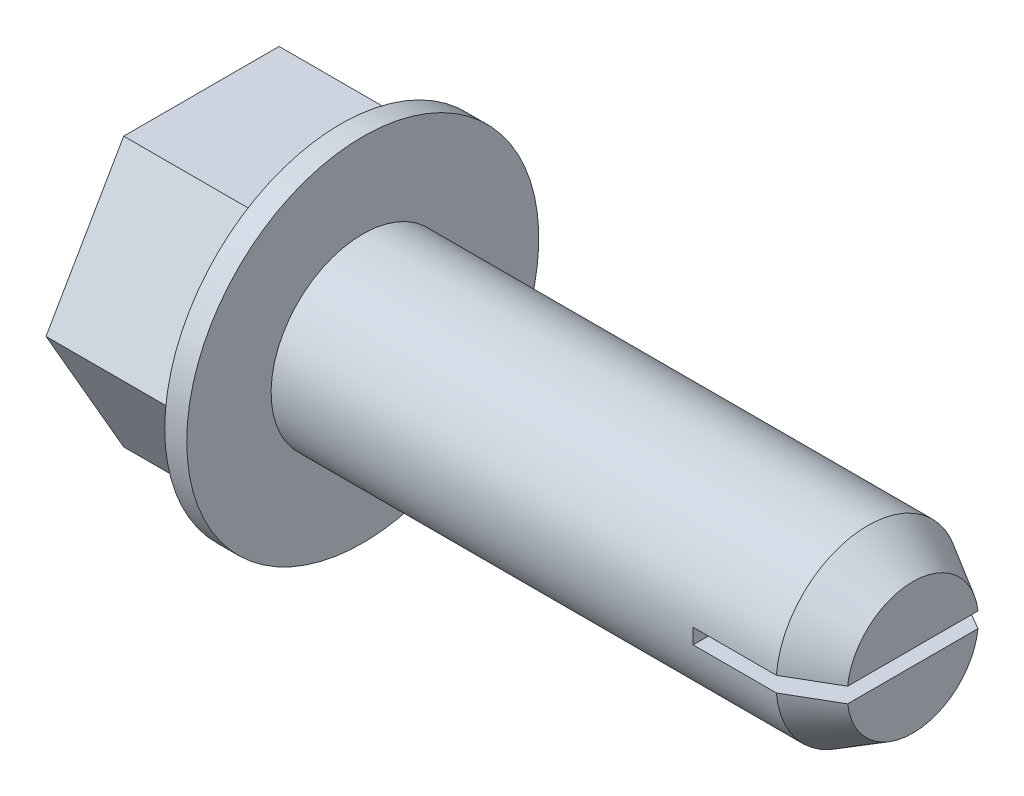
ISO-10303-21;
HEADER;
FILE_DESCRIPTION(('STEP AP214'),'2;1');
FILE_NAME('part.step','',(''),(''),'','','');
FILE_SCHEMA(('AUTOMOTIVE_DESIGN { 1 0 10303 214 1 1 1 1 }'));
ENDSEC;
DATA;
#1=APPLICATION_CONTEXT('core data for automotive mechanical design processes');
#2=APPLICATION_PROTOCOL_DEFINITION('international standard','automotive_design',2000,#1);
#3=PRODUCT_CONTEXT('',#1,'mechanical');
#4=PRODUCT('Part','Part','',(#3));
#5=PRODUCT_RELATED_PRODUCT_CATEGORY('part','',(#4));
#6=PRODUCT_DEFINITION_FORMATION('','',#4);
#7=PRODUCT_DEFINITION_CONTEXT('part definition',#1,'design');
#8=PRODUCT_DEFINITION('design','',#6,#7);
#9=PRODUCT_DEFINITION_SHAPE('','',#8);
#10=(LENGTH_UNIT() NAMED_UNIT(*) SI_UNIT(.MILLI.,.METRE.));
#11=(NAMED_UNIT(*) PLANE_ANGLE_UNIT() SI_UNIT($,.RADIAN.));
#12=(NAMED_UNIT(*) SI_UNIT($,.STERADIAN.) SOLID_ANGLE_UNIT());
#13=UNCERTAINTY_MEASURE_WITH_UNIT(LENGTH_MEASURE(1.E-05),#10,'distance_accuracy_value','');
#14=(GEOMETRIC_REPRESENTATION_CONTEXT(3) GLOBAL_UNCERTAINTY_ASSIGNED_CONTEXT((#13)) GLOBAL_UNIT_ASSIGNED_CONTEXT((#10,
#11,#12)) REPRESENTATION_CONTEXT('',''));
#15=CARTESIAN_POINT('',(0.,0.,0.));
#16=DIRECTION('',(0.,0.,1.));
#17=DIRECTION('',(1.,0.,0.));
#18=AXIS2_PLACEMENT_3D('',#15,#16,#17);
#19=CARTESIAN_POINT('',(14.605,0.,0.));
#20=DIRECTION('',(1.,0.,0.));
#21=DIRECTION('',(0.,0.,-1.));
#22=AXIS2_PLACEMENT_3D('',#19,#20,#21);
#23=PLANE('',#22);
#24=CARTESIAN_POINT('',(14.605,0.,0.));
#25=DIRECTION('',(1.,0.,0.));
#26=DIRECTION('',(0.,0.,-1.));
#27=AXIS2_PLACEMENT_3D('',#24,#25,#26);
#28=CIRCLE('',#27,3.175);
#29=CARTESIAN_POINT('',(14.605,0.264583333333334,3.16395648827891));
#30=VERTEX_POINT('',#29);
#31=CARTESIAN_POINT('',(14.605,-0.264583333333334,3.16395648827891));
#32=VERTEX_POINT('',#31);
#33=EDGE_CURVE('E173',#30,#32,#28,.T.);
#34=ORIENTED_EDGE('',*,*,#33,.T.);
#35=DIRECTION('',(0.,0.,1.));
#36=VECTOR('',#35,1.);
#37=CARTESIAN_POINT('',(14.605,-0.264583333333334,3.16395648827891));
#38=LINE('',#37,#36);
#39=CARTESIAN_POINT('',(14.605,-0.264583333333334,-3.16395648827891));
#40=VERTEX_POINT('',#39);
#41=EDGE_CURVE('E157',#40,#32,#38,.T.);
#42=ORIENTED_EDGE('',*,*,#41,.F.);
#43=CARTESIAN_POINT('',(14.605,0.264583333333334,-3.16395648827891));
#44=VERTEX_POINT('',#43);
#45=EDGE_CURVE('E177',#40,#44,#28,.T.);
#46=ORIENTED_EDGE('',*,*,#45,.T.);
#47=DIRECTION('',(0.,0.,1.));
#48=VECTOR('',#47,1.);
#49=CARTESIAN_POINT('',(14.605,0.264583333333334,-3.16395648827891));
#50=LINE('',#49,#48);
#51=EDGE_CURVE('E176',#44,#30,#50,.T.);
#52=ORIENTED_EDGE('',*,*,#51,.T.);
#53=EDGE_LOOP('',(#34,#42,#46,#52));
#54=FACE_BOUND('',#53,.T.);
#55=ADVANCED_FACE('F37',(#54),#23,.T.);
#56=CARTESIAN_POINT('',(0.,0.,0.));
#57=DIRECTION('',(-1.,0.,0.));
#58=DIRECTION('',(0.,0.,1.));
#59=AXIS2_PLACEMENT_3D('',#56,#57,#58);
#60=CYLINDRICAL_SURFACE('',#59,6.096);
#61=CARTESIAN_POINT('',(0.,0.,0.));
#62=DIRECTION('',(-1.,0.,0.));
#63=DIRECTION('',(0.,0.,1.));
#64=AXIS2_PLACEMENT_3D('',#61,#62,#63);
#65=CIRCLE('',#64,6.096);
#66=CARTESIAN_POINT('',(0.,0.,6.096));
#67=VERTEX_POINT('',#66);
#68=EDGE_CURVE('E191',#67,#67,#65,.T.);
#69=ORIENTED_EDGE('',*,*,#68,.T.);
#70=EDGE_LOOP('',(#69));
#71=FACE_BOUND('',#70,.T.);
#72=CARTESIAN_POINT('',(-0.762,0.,0.));
#73=DIRECTION('',(-1.,0.,0.));
#74=DIRECTION('',(0.,0.,1.));
#75=AXIS2_PLACEMENT_3D('',#72,#73,#74);
#76=CIRCLE('',#75,6.096);
#77=CARTESIAN_POINT('',(-0.762,0.,6.096));
#78=VERTEX_POINT('',#77);
#79=EDGE_CURVE('E185',#78,#78,#76,.T.);
#80=ORIENTED_EDGE('',*,*,#79,.F.);
#81=EDGE_LOOP('',(#80));
#82=FACE_BOUND('',#81,.T.);
#83=ADVANCED_FACE('F225',(#71,#82),#60,.T.);
#84=CARTESIAN_POINT('',(0.,6.096,0.));
#85=DIRECTION('',(1.,0.,0.));
#86=DIRECTION('',(0.,0.,-1.));
#87=AXIS2_PLACEMENT_3D('',#84,#85,#86);
#88=PLANE('',#87);
#89=CARTESIAN_POINT('',(0.,0.,0.));
#90=DIRECTION('',(1.,0.,0.));
#91=DIRECTION('',(0.,0.,-1.));
#92=AXIS2_PLACEMENT_3D('',#89,#90,#91);
#93=CIRCLE('',#92,3.175);
#94=CARTESIAN_POINT('',(0.,0.,-3.175));
#95=VERTEX_POINT('',#94);
#96=EDGE_CURVE('E187',#95,#95,#93,.T.);
#97=ORIENTED_EDGE('',*,*,#96,.F.);
#98=EDGE_LOOP('',(#97));
#99=FACE_BOUND('',#98,.T.);
#100=ORIENTED_EDGE('',*,*,#68,.F.);
#101=EDGE_LOOP('',(#100));
#102=FACE_BOUND('',#101,.T.);
#103=ADVANCED_FACE('F341',(#99,#102),#88,.T.);
#104=CARTESIAN_POINT('',(-0.762,0.,0.));
#105=DIRECTION('',(-1.,0.,0.));
#106=DIRECTION('',(0.,0.,1.));
#107=AXIS2_PLACEMENT_3D('',#104,#105,#106);
#108=PLANE('',#107);
#109=DIRECTION('',(0.,-0.866025403784439,0.5));
#110=VECTOR('',#109,1.);
#111=CARTESIAN_POINT('',(-0.762,-4.6609,-2.69097186966593));
#112=LINE('',#111,#110);
#113=CARTESIAN_POINT('',(-0.762,0.,-5.38194373933185));
#114=VERTEX_POINT('',#113);
#115=CARTESIAN_POINT('',(-0.762,-4.6609,-2.69097186966593));
#116=VERTEX_POINT('',#115);
#117=EDGE_CURVE('E156',#114,#116,#112,.T.);
#118=ORIENTED_EDGE('',*,*,#117,.F.);
#119=DIRECTION('',(0.,-0.866025403784439,-0.5));
#120=VECTOR('',#119,1.);
#121=CARTESIAN_POINT('',(-0.762,0.,-5.38194373933185));
#122=LINE('',#121,#120);
#123=CARTESIAN_POINT('',(-0.762,4.6609,-2.69097186966593));
#124=VERTEX_POINT('',#123);
#125=EDGE_CURVE('E153',#124,#114,#122,.T.);
#126=ORIENTED_EDGE('',*,*,#125,.F.);
#127=DIRECTION('',(0.,0.,-1.));
#128=VECTOR('',#127,1.);
#129=CARTESIAN_POINT('',(-0.762,4.6609,-2.69097186966593));
#130=LINE('',#129,#128);
#131=CARTESIAN_POINT('',(-0.762,4.6609,2.69097186966593));
#132=VERTEX_POINT('',#131);
#133=EDGE_CURVE('E320',#132,#124,#130,.T.);
#134=ORIENTED_EDGE('',*,*,#133,.F.);
#135=DIRECTION('',(0.,0.866025403784439,-0.5));
#136=VECTOR('',#135,1.);
#137=CARTESIAN_POINT('',(-0.762,4.6609,2.69097186966593));
#138=LINE('',#137,#136);
#139=CARTESIAN_POINT('',(-0.762,0.,5.38194373933185));
#140=VERTEX_POINT('',#139);
#141=EDGE_CURVE('E317',#140,#132,#138,.T.);
#142=ORIENTED_EDGE('',*,*,#141,.F.);
#143=DIRECTION('',(0.,0.866025403784439,0.5));
#144=VECTOR('',#143,1.);
#145=CARTESIAN_POINT('',(-0.762,0.,5.38194373933185));
#146=LINE('',#145,#144);
#147=CARTESIAN_POINT('',(-0.762,-4.6609,2.69097186966593));
#148=VERTEX_POINT('',#147);
#149=EDGE_CURVE('E314',#148,#140,#146,.T.);
#150=ORIENTED_EDGE('',*,*,#149,.F.);
#151=DIRECTION('',(0.,0.,1.));
#152=VECTOR('',#151,1.);
#153=CARTESIAN_POINT('',(-0.762,-4.6609,2.69097186966593));
#154=LINE('',#153,#152);
#155=EDGE_CURVE('E312',#116,#148,#154,.T.);
#156=ORIENTED_EDGE('',*,*,#155,.F.);
#157=EDGE_LOOP('',(#118,#126,#134,#142,#150,#156));
#158=FACE_BOUND('',#157,.T.);
#159=ORIENTED_EDGE('',*,*,#79,.T.);
#160=EDGE_LOOP('',(#159));
#161=FACE_BOUND('',#160,.T.);
#162=ADVANCED_FACE('F336',(#158,#161),#108,.T.);
#163=CARTESIAN_POINT('',(19.05,0.,0.));
#164=DIRECTION('',(-1.,0.,0.));
#165=DIRECTION('',(0.,0.,1.));
#166=AXIS2_PLACEMENT_3D('',#163,#164,#165);
#167=CYLINDRICAL_SURFACE('',#166,3.175);
#168=DIRECTION('',(-1.,0.,0.));
#169=VECTOR('',#168,1.);
#170=CARTESIAN_POINT('',(19.05,-0.264583333333334,-3.16395648827891));
#171=LINE('',#170,#169);
#172=CARTESIAN_POINT('',(17.4882097868151,-0.264583333333334,-3.16395648827891));
#173=VERTEX_POINT('',#172);
#174=EDGE_CURVE('E170',#173,#40,#171,.T.);
#175=ORIENTED_EDGE('',*,*,#174,.F.);
#176=CARTESIAN_POINT('',(17.4882097868151,0.,0.));
#177=DIRECTION('',(-1.,0.,0.));
#178=DIRECTION('',(0.,0.,1.));
#179=AXIS2_PLACEMENT_3D('',#176,#177,#178);
#180=CIRCLE('',#179,3.175);
#181=CARTESIAN_POINT('',(17.4882097868151,-0.264583333333334,3.16395648827891));
#182=VERTEX_POINT('',#181);
#183=EDGE_CURVE('E240',#173,#182,#180,.T.);
#184=ORIENTED_EDGE('',*,*,#183,.T.);
#185=DIRECTION('',(-1.,0.,0.));
#186=VECTOR('',#185,1.);
#187=CARTESIAN_POINT('',(19.05,-0.264583333333334,3.16395648827891));
#188=LINE('',#187,#186);
#189=EDGE_CURVE('E167',#182,#32,#188,.T.);
#190=ORIENTED_EDGE('',*,*,#189,.T.);
#191=ORIENTED_EDGE('',*,*,#33,.F.);
#192=DIRECTION('',(1.,0.,0.));
#193=VECTOR('',#192,1.);
#194=CARTESIAN_POINT('',(14.605,0.264583333333334,3.16395648827891));
#195=LINE('',#194,#193);
#196=CARTESIAN_POINT('',(17.4882097868151,0.264583333333334,3.16395648827891));
#197=VERTEX_POINT('',#196);
#198=EDGE_CURVE('E182',#30,#197,#195,.T.);
#199=ORIENTED_EDGE('',*,*,#198,.T.);
#200=CARTESIAN_POINT('',(17.4882097868151,0.,0.));
#201=DIRECTION('',(1.,0.,0.));
#202=DIRECTION('',(0.,0.,-1.));
#203=AXIS2_PLACEMENT_3D('',#200,#201,#202);
#204=CIRCLE('',#203,3.175);
#205=CARTESIAN_POINT('',(17.4882097868151,0.264583333333334,-3.16395648827891));
#206=VERTEX_POINT('',#205);
#207=EDGE_CURVE('E241',#197,#206,#204,.F.);
#208=ORIENTED_EDGE('',*,*,#207,.T.);
#209=DIRECTION('',(1.,0.,0.));
#210=VECTOR('',#209,1.);
#211=CARTESIAN_POINT('',(14.605,0.264583333333334,-3.16395648827891));
#212=LINE('',#211,#210);
#213=EDGE_CURVE('E180',#44,#206,#212,.T.);
#214=ORIENTED_EDGE('',*,*,#213,.F.);
#215=ORIENTED_EDGE('',*,*,#45,.F.);
#216=EDGE_LOOP('',(#175,#184,#190,#191,#199,#208,#214,#215));
#217=FACE_BOUND('',#216,.T.);
#218=ORIENTED_EDGE('',*,*,#96,.T.);
#219=EDGE_LOOP('',(#218));
#220=FACE_BOUND('',#219,.T.);
#221=ADVANCED_FACE('F251',(#217,#220),#167,.T.);
#222=CARTESIAN_POINT('',(19.05,0.,0.));
#223=DIRECTION('',(1.,0.,0.));
#224=DIRECTION('',(0.,0.,-1.));
#225=AXIS2_PLACEMENT_3D('',#222,#223,#224);
#226=PLANE('',#225);
#227=DIRECTION('',(0.,0.,1.));
#228=VECTOR('',#227,1.);
#229=CARTESIAN_POINT('',(19.05,0.264583333333334,-3.16395648827891));
#230=LINE('',#229,#228);
#231=CARTESIAN_POINT('',(19.05,0.264583333333334,-2.25785042678254));
#232=VERTEX_POINT('',#231);
#233=CARTESIAN_POINT('',(19.05,0.264583333333334,2.25785042678254));
#234=VERTEX_POINT('',#233);
#235=EDGE_CURVE('E172',#232,#234,#230,.T.);
#236=ORIENTED_EDGE('',*,*,#235,.F.);
#237=CARTESIAN_POINT('',(19.05,0.,0.));
#238=DIRECTION('',(1.,0.,0.));
#239=DIRECTION('',(0.,0.,-1.));
#240=AXIS2_PLACEMENT_3D('',#237,#238,#239);
#241=CIRCLE('',#240,2.27329999999997);
#242=EDGE_CURVE('E238',#232,#234,#241,.T.);
#243=ORIENTED_EDGE('',*,*,#242,.T.);
#244=EDGE_LOOP('',(#236,#243));
#245=FACE_BOUND('',#244,.T.);
#246=ADVANCED_FACE('F230',(#245),#226,.T.);
#247=CARTESIAN_POINT('',(14.605,0.264583333333334,-3.16395648827891));
#248=DIRECTION('',(0.,1.,0.));
#249=DIRECTION('',(0.,0.,1.));
#250=AXIS2_PLACEMENT_3D('',#247,#248,#249);
#251=PLANE('',#250);
#252=ORIENTED_EDGE('',*,*,#235,.T.);
#253=CARTESIAN_POINT('',(19.05,0.264583333333334,2.25785042678254));
#254=CARTESIAN_POINT('',(18.9199136361924,0.264583333333334,2.33346750790651));
#255=CARTESIAN_POINT('',(18.7898067189616,0.264583333333334,2.40904920793891));
#256=CARTESIAN_POINT('',(18.5295590617369,0.264583333333334,2.56015431966926));
#257=CARTESIAN_POINT('',(18.3994183217473,0.264583333333334,2.63567773137455));
#258=CARTESIAN_POINT('',(18.0089562454983,0.264583333333334,2.86217927280327));
#259=CARTESIAN_POINT('',(17.7485950521317,0.264583333333334,3.01308870932013));
#260=CARTESIAN_POINT('',(17.4882097868151,0.264583333333334,3.16395648827891));
#261=B_SPLINE_CURVE_WITH_KNOTS('',3,(#253,#254,#255,#256,#257,#258,#259,#260),.UNSPECIFIED.,.F.,
.F.,(4,2,2,4),(0.,0.451401842563353,0.902803628354309,1.8056071970664),.UNSPECIFIED.);
#262=EDGE_CURVE('E11',#234,#197,#261,.T.);
#263=ORIENTED_EDGE('',*,*,#262,.T.);
#264=ORIENTED_EDGE('',*,*,#198,.F.);
#265=ORIENTED_EDGE('',*,*,#51,.F.);
#266=ORIENTED_EDGE('',*,*,#213,.T.);
#267=CARTESIAN_POINT('',(17.4882097868151,0.264583333333334,-3.16395648827891));
#268=CARTESIAN_POINT('',(17.7485950521316,0.264583333333334,-3.01308870932013));
#269=CARTESIAN_POINT('',(18.0089562454983,0.264583333333334,-2.86217927280327));
#270=CARTESIAN_POINT('',(18.3994183217473,0.264583333333334,-2.63567773137455));
#271=CARTESIAN_POINT('',(18.5295590617369,0.264583333333334,-2.56015431966926));
#272=CARTESIAN_POINT('',(18.7898067189616,0.264583333333334,-2.40904920793891));
#273=CARTESIAN_POINT('',(18.9199136361924,0.264583333333334,-2.33346750790651));
#274=CARTESIAN_POINT('',(19.05,0.264583333333334,-2.25785042678254));
#275=B_SPLINE_CURVE_WITH_KNOTS('',3,(#267,#268,#269,#270,#271,#272,#273,#274),.UNSPECIFIED.,.F.,
.F.,(4,2,2,4),(0.,0.902803568712091,1.35420535450305,1.8056071970664),.UNSPECIFIED.);
#276=EDGE_CURVE('E51',#206,#232,#275,.T.);
#277=ORIENTED_EDGE('',*,*,#276,.T.);
#278=EDGE_LOOP('',(#252,#263,#264,#265,#266,#277));
#279=FACE_BOUND('',#278,.T.);
#280=ADVANCED_FACE('F220',(#279),#251,.F.);
#281=CARTESIAN_POINT('',(19.05,-0.264583333333334,3.16395648827891));
#282=DIRECTION('',(0.,-1.,0.));
#283=DIRECTION('',(0.,0.,-1.));
#284=AXIS2_PLACEMENT_3D('',#281,#282,#283);
#285=PLANE('',#284);
#286=DIRECTION('',(0.,0.,1.));
#287=VECTOR('',#286,1.);
#288=CARTESIAN_POINT('',(19.05,-0.264583333333334,3.16395648827891));
#289=LINE('',#288,#287);
#290=CARTESIAN_POINT('',(19.05,-0.264583333333334,-2.25785042678254));
#291=VERTEX_POINT('',#290);
#292=CARTESIAN_POINT('',(19.05,-0.264583333333334,2.25785042678254));
#293=VERTEX_POINT('',#292);
#294=EDGE_CURVE('E160',#291,#293,#289,.T.);
#295=ORIENTED_EDGE('',*,*,#294,.F.);
#296=CARTESIAN_POINT('',(19.05,-0.264583333333334,-2.25785042678254));
#297=CARTESIAN_POINT('',(18.9199136361924,-0.264583333333334,-2.33346750790651));
#298=CARTESIAN_POINT('',(18.7898067189616,-0.264583333333334,-2.40904920793891));
#299=CARTESIAN_POINT('',(18.5295590617369,-0.264583333333334,-2.56015431966926));
#300=CARTESIAN_POINT('',(18.3994183217473,-0.264583333333334,-2.63567773137455));
#301=CARTESIAN_POINT('',(18.0089562454983,-0.264583333333334,-2.86217927280327));
#302=CARTESIAN_POINT('',(17.7485950521317,-0.264583333333334,-3.01308870932013));
#303=CARTESIAN_POINT('',(17.4882097868151,-0.264583333333334,-3.16395648827891));
#304=B_SPLINE_CURVE_WITH_KNOTS('',3,(#296,#297,#298,#299,#300,#301,#302,#303),.UNSPECIFIED.,.F.,
.F.,(4,2,2,4),(0.,0.451401842563353,0.902803628354309,1.8056071970664),.UNSPECIFIED.);
#305=EDGE_CURVE('E205',#291,#173,#304,.T.);
#306=ORIENTED_EDGE('',*,*,#305,.T.);
#307=ORIENTED_EDGE('',*,*,#174,.T.);
#308=ORIENTED_EDGE('',*,*,#41,.T.);
#309=ORIENTED_EDGE('',*,*,#189,.F.);
#310=CARTESIAN_POINT('',(17.4882097868151,-0.264583333333334,3.16395648827891));
#311=CARTESIAN_POINT('',(17.7485950521316,-0.264583333333334,3.01308870932013));
#312=CARTESIAN_POINT('',(18.0089562454983,-0.264583333333334,2.86217927280327));
#313=CARTESIAN_POINT('',(18.3994183217473,-0.264583333333334,2.63567773137455));
#314=CARTESIAN_POINT('',(18.5295590617369,-0.264583333333334,2.56015431966926));
#315=CARTESIAN_POINT('',(18.7898067189616,-0.264583333333334,2.40904920793891));
#316=CARTESIAN_POINT('',(18.9199136361924,-0.264583333333334,2.33346750790651));
#317=CARTESIAN_POINT('',(19.05,-0.264583333333334,2.25785042678254));
#318=B_SPLINE_CURVE_WITH_KNOTS('',3,(#310,#311,#312,#313,#314,#315,#316,#317),.UNSPECIFIED.,.F.,
.F.,(4,2,2,4),(0.,0.902803568712091,1.35420535450305,1.8056071970664),.UNSPECIFIED.);
#319=EDGE_CURVE('E198',#182,#293,#318,.T.);
#320=ORIENTED_EDGE('',*,*,#319,.T.);
#321=EDGE_LOOP('',(#295,#306,#307,#308,#309,#320));
#322=FACE_BOUND('',#321,.T.);
#323=ADVANCED_FACE('F214',(#322),#285,.F.);
#324=CARTESIAN_POINT('',(19.05,0.,0.));
#325=DIRECTION('',(-1.,0.,0.));
#326=DIRECTION('',(0.,0.,1.));
#327=AXIS2_PLACEMENT_3D('',#324,#325,#326);
#328=PLANE('',#327);
#329=ORIENTED_EDGE('',*,*,#294,.T.);
#330=CARTESIAN_POINT('',(19.05,0.,0.));
#331=DIRECTION('',(-1.,0.,0.));
#332=DIRECTION('',(0.,0.,1.));
#333=AXIS2_PLACEMENT_3D('',#330,#331,#332);
#334=CIRCLE('',#333,2.27329999999997);
#335=EDGE_CURVE('E190',#293,#291,#334,.F.);
#336=ORIENTED_EDGE('',*,*,#335,.T.);
#337=EDGE_LOOP('',(#329,#336));
#338=FACE_BOUND('',#337,.T.);
#339=ADVANCED_FACE('F219',(#338),#328,.F.);
#340=CARTESIAN_POINT('',(-5.588,-4.6609,-2.69097186966593));
#341=DIRECTION('',(0.,0.5,0.866025403784439));
#342=DIRECTION('',(0.,-0.866025403784439,0.5));
#343=AXIS2_PLACEMENT_3D('',#340,#341,#342);
#344=PLANE('',#343);
#345=ORIENTED_EDGE('',*,*,#117,.T.);
#346=DIRECTION('',(1.,0.,0.));
#347=VECTOR('',#346,1.);
#348=CARTESIAN_POINT('',(-5.588,-4.6609,-2.69097186966593));
#349=LINE('',#348,#347);
#350=CARTESIAN_POINT('',(-5.588,-4.6609,-2.69097186966593));
#351=VERTEX_POINT('',#350);
#352=EDGE_CURVE('E137',#351,#116,#349,.T.);
#353=ORIENTED_EDGE('',*,*,#352,.F.);
#354=DIRECTION('',(0.,-0.866025403784439,0.5));
#355=VECTOR('',#354,1.);
#356=CARTESIAN_POINT('',(-5.588,-4.6609,-2.69097186966593));
#357=LINE('',#356,#355);
#358=CARTESIAN_POINT('',(-5.588,0.,-5.38194373933185));
#359=VERTEX_POINT('',#358);
#360=EDGE_CURVE('E144',#359,#351,#357,.T.);
#361=ORIENTED_EDGE('',*,*,#360,.F.);
#362=DIRECTION('',(1.,0.,0.));
#363=VECTOR('',#362,1.);
#364=CARTESIAN_POINT('',(-5.588,0.,-5.38194373933185));
#365=LINE('',#364,#363);
#366=EDGE_CURVE('E310',#359,#114,#365,.T.);
#367=ORIENTED_EDGE('',*,*,#366,.T.);
#368=EDGE_LOOP('',(#345,#353,#361,#367));
#369=FACE_BOUND('',#368,.T.);
#370=ADVANCED_FACE('F155',(#369),#344,.F.);
#371=CARTESIAN_POINT('',(-5.588,-4.6609,2.69097186966593));
#372=DIRECTION('',(0.,1.,0.));
#373=DIRECTION('',(0.,0.,1.));
#374=AXIS2_PLACEMENT_3D('',#371,#372,#373);
#375=PLANE('',#374);
#376=ORIENTED_EDGE('',*,*,#155,.T.);
#377=DIRECTION('',(1.,0.,0.));
#378=VECTOR('',#377,1.);
#379=CARTESIAN_POINT('',(-5.588,-4.6609,2.69097186966593));
#380=LINE('',#379,#378);
#381=CARTESIAN_POINT('',(-5.588,-4.6609,2.69097186966593));
#382=VERTEX_POINT('',#381);
#383=EDGE_CURVE('E140',#382,#148,#380,.T.);
#384=ORIENTED_EDGE('',*,*,#383,.F.);
#385=DIRECTION('',(0.,0.,1.));
#386=VECTOR('',#385,1.);
#387=CARTESIAN_POINT('',(-5.588,-4.6609,2.69097186966593));
#388=LINE('',#387,#386);
#389=EDGE_CURVE('E132',#351,#382,#388,.T.);
#390=ORIENTED_EDGE('',*,*,#389,.F.);
#391=ORIENTED_EDGE('',*,*,#352,.T.);
#392=EDGE_LOOP('',(#376,#384,#390,#391));
#393=FACE_BOUND('',#392,.T.);
#394=ADVANCED_FACE('F135',(#393),#375,.F.);
#395=CARTESIAN_POINT('',(-5.588,0.,5.38194373933185));
#396=DIRECTION('',(0.,0.5,-0.866025403784439));
#397=DIRECTION('',(0.,0.866025403784439,0.5));
#398=AXIS2_PLACEMENT_3D('',#395,#396,#397);
#399=PLANE('',#398);
#400=ORIENTED_EDGE('',*,*,#149,.T.);
#401=DIRECTION('',(1.,0.,0.));
#402=VECTOR('',#401,1.);
#403=CARTESIAN_POINT('',(-5.588,0.,5.38194373933185));
#404=LINE('',#403,#402);
#405=CARTESIAN_POINT('',(-5.588,0.,5.38194373933185));
#406=VERTEX_POINT('',#405);
#407=EDGE_CURVE('E162',#406,#140,#404,.T.);
#408=ORIENTED_EDGE('',*,*,#407,.F.);
#409=DIRECTION('',(0.,0.866025403784439,0.5));
#410=VECTOR('',#409,1.);
#411=CARTESIAN_POINT('',(-5.588,0.,5.38194373933185));
#412=LINE('',#411,#410);
#413=EDGE_CURVE('E143',#382,#406,#412,.T.);
#414=ORIENTED_EDGE('',*,*,#413,.F.);
#415=ORIENTED_EDGE('',*,*,#383,.T.);
#416=EDGE_LOOP('',(#400,#408,#414,#415));
#417=FACE_BOUND('',#416,.T.);
#418=ADVANCED_FACE('F263',(#417),#399,.F.);
#419=CARTESIAN_POINT('',(-5.588,4.6609,2.69097186966593));
#420=DIRECTION('',(0.,-0.5,-0.866025403784439));
#421=DIRECTION('',(0.,0.866025403784439,-0.5));
#422=AXIS2_PLACEMENT_3D('',#419,#420,#421);
#423=PLANE('',#422);
#424=ORIENTED_EDGE('',*,*,#141,.T.);
#425=DIRECTION('',(1.,0.,0.));
#426=VECTOR('',#425,1.);
#427=CARTESIAN_POINT('',(-5.588,4.6609,2.69097186966593));
#428=LINE('',#427,#426);
#429=CARTESIAN_POINT('',(-5.588,4.6609,2.69097186966593));
#430=VERTEX_POINT('',#429);
#431=EDGE_CURVE('E329',#430,#132,#428,.T.);
#432=ORIENTED_EDGE('',*,*,#431,.F.);
#433=DIRECTION('',(0.,0.866025403784439,-0.5));
#434=VECTOR('',#433,1.);
#435=CARTESIAN_POINT('',(-5.588,4.6609,2.69097186966593));
#436=LINE('',#435,#434);
#437=EDGE_CURVE('E305',#406,#430,#436,.T.);
#438=ORIENTED_EDGE('',*,*,#437,.F.);
#439=ORIENTED_EDGE('',*,*,#407,.T.);
#440=EDGE_LOOP('',(#424,#432,#438,#439));
#441=FACE_BOUND('',#440,.T.);
#442=ADVANCED_FACE('F268',(#441),#423,.F.);
#443=CARTESIAN_POINT('',(-5.588,4.6609,-2.69097186966593));
#444=DIRECTION('',(0.,-1.,0.));
#445=DIRECTION('',(0.,0.,-1.));
#446=AXIS2_PLACEMENT_3D('',#443,#444,#445);
#447=PLANE('',#446);
#448=ORIENTED_EDGE('',*,*,#133,.T.);
#449=DIRECTION('',(1.,0.,0.));
#450=VECTOR('',#449,1.);
#451=CARTESIAN_POINT('',(-5.588,4.6609,-2.69097186966593));
#452=LINE('',#451,#450);
#453=CARTESIAN_POINT('',(-5.588,4.6609,-2.69097186966593));
#454=VERTEX_POINT('',#453);
#455=EDGE_CURVE('E326',#454,#124,#452,.T.);
#456=ORIENTED_EDGE('',*,*,#455,.F.);
#457=DIRECTION('',(0.,0.,-1.));
#458=VECTOR('',#457,1.);
#459=CARTESIAN_POINT('',(-5.588,4.6609,-2.69097186966593));
#460=LINE('',#459,#458);
#461=EDGE_CURVE('E307',#430,#454,#460,.T.);
#462=ORIENTED_EDGE('',*,*,#461,.F.);
#463=ORIENTED_EDGE('',*,*,#431,.T.);
#464=EDGE_LOOP('',(#448,#456,#462,#463));
#465=FACE_BOUND('',#464,.T.);
#466=ADVANCED_FACE('F272',(#465),#447,.F.);
#467=CARTESIAN_POINT('',(-5.588,0.,-5.38194373933185));
#468=DIRECTION('',(0.,-0.5,0.866025403784439));
#469=DIRECTION('',(0.,-0.866025403784439,-0.5));
#470=AXIS2_PLACEMENT_3D('',#467,#468,#469);
#471=PLANE('',#470);
#472=ORIENTED_EDGE('',*,*,#125,.T.);
#473=ORIENTED_EDGE('',*,*,#366,.F.);
#474=DIRECTION('',(0.,-0.866025403784439,-0.5));
#475=VECTOR('',#474,1.);
#476=CARTESIAN_POINT('',(-5.588,0.,-5.38194373933185));
#477=LINE('',#476,#475);
#478=EDGE_CURVE('E149',#454,#359,#477,.T.);
#479=ORIENTED_EDGE('',*,*,#478,.F.);
#480=ORIENTED_EDGE('',*,*,#455,.T.);
#481=EDGE_LOOP('',(#472,#473,#479,#480));
#482=FACE_BOUND('',#481,.T.);
#483=ADVANCED_FACE('F276',(#482),#471,.F.);
#484=CARTESIAN_POINT('',(-5.588,0.,0.));
#485=DIRECTION('',(1.,0.,0.));
#486=DIRECTION('',(0.,0.,-1.));
#487=AXIS2_PLACEMENT_3D('',#484,#485,#486);
#488=PLANE('',#487);
#489=CARTESIAN_POINT('',(-5.588,0.,3.62967632841249E-11));
#490=DIRECTION('',(-1.,0.,-6.49548376597981E-12));
#491=DIRECTION('',(-6.49548376597981E-12,0.,1.));
#492=AXIS2_PLACEMENT_3D('',#489,#490,#491);
#493=CIRCLE('',#492,3.72871999999999);
#494=CARTESIAN_POINT('',(-5.58800000002422,0.,3.72872000003629));
#495=VERTEX_POINT('',#494);
#496=EDGE_CURVE('E300',#495,#495,#493,.T.);
#497=ORIENTED_EDGE('',*,*,#496,.F.);
#498=EDGE_LOOP('',(#497));
#499=FACE_BOUND('',#498,.T.);
#500=ORIENTED_EDGE('',*,*,#360,.T.);
#501=ORIENTED_EDGE('',*,*,#389,.T.);
#502=ORIENTED_EDGE('',*,*,#413,.T.);
#503=ORIENTED_EDGE('',*,*,#437,.T.);
#504=ORIENTED_EDGE('',*,*,#461,.T.);
#505=ORIENTED_EDGE('',*,*,#478,.T.);
#506=EDGE_LOOP('',(#500,#501,#502,#503,#504,#505));
#507=FACE_BOUND('',#506,.T.);
#508=ADVANCED_FACE('F147',(#499,#507),#488,.F.);
#509=CARTESIAN_POINT('',(-4.62280000000001,0.,4.25662042150485E-11));
#510=DIRECTION('',(1.,0.,6.49548376597981E-12));
#511=DIRECTION('',(6.49548376597981E-12,0.,-1.));
#512=AXIS2_PLACEMENT_3D('',#509,#510,#511);
#513=PLANE('',#512);
#514=CARTESIAN_POINT('',(-4.6228,0.,4.25662042150486E-11));
#515=DIRECTION('',(-1.,0.,-6.49548376597981E-12));
#516=DIRECTION('',(-6.49548376597981E-12,0.,1.));
#517=AXIS2_PLACEMENT_3D('',#514,#515,#516);
#518=CIRCLE('',#517,3.72871999999999);
#519=CARTESIAN_POINT('',(-4.62280000002422,0.,3.72872000004256));
#520=VERTEX_POINT('',#519);
#521=EDGE_CURVE('E297',#520,#520,#518,.T.);
#522=ORIENTED_EDGE('',*,*,#521,.T.);
#523=EDGE_LOOP('',(#522));
#524=FACE_BOUND('',#523,.T.);
#525=ADVANCED_FACE('F283',(#524),#513,.F.);
#526=CARTESIAN_POINT('',(-5.588,0.,3.62967632841249E-11));
#527=DIRECTION('',(-1.,0.,-6.49548376597981E-12));
#528=DIRECTION('',(-6.49548376597981E-12,0.,1.));
#529=AXIS2_PLACEMENT_3D('',#526,#527,#528);
#530=CYLINDRICAL_SURFACE('',#529,3.72871999999999);
#531=ORIENTED_EDGE('',*,*,#521,.F.);
#532=EDGE_LOOP('',(#531));
#533=FACE_BOUND('',#532,.T.);
#534=ORIENTED_EDGE('',*,*,#496,.T.);
#535=EDGE_LOOP('',(#534));
#536=FACE_BOUND('',#535,.T.);
#537=ADVANCED_FACE('F287',(#533,#536),#530,.F.);
#538=CARTESIAN_POINT('',(19.05,0.,0.));
#539=DIRECTION('',(-1.,0.,0.));
#540=DIRECTION('',(0.,0.,1.));
#541=AXIS2_PLACEMENT_3D('',#538,#539,#540);
#542=CONICAL_SURFACE('',#541,2.27329999999997,0.523598775598295);
#543=ORIENTED_EDGE('',*,*,#319,.F.);
#544=ORIENTED_EDGE('',*,*,#183,.F.);
#545=ORIENTED_EDGE('',*,*,#305,.F.);
#546=ORIENTED_EDGE('',*,*,#335,.F.);
#547=EDGE_LOOP('',(#543,#544,#545,#546));
#548=FACE_BOUND('',#547,.T.);
#549=ADVANCED_FACE('F211',(#548),#542,.T.);
#550=CARTESIAN_POINT('',(19.05,0.,0.));
#551=DIRECTION('',(-1.,0.,0.));
#552=DIRECTION('',(0.,0.,1.));
#553=AXIS2_PLACEMENT_3D('',#550,#551,#552);
#554=CONICAL_SURFACE('',#553,2.27329999999997,0.523598775598295);
#555=ORIENTED_EDGE('',*,*,#276,.F.);
#556=ORIENTED_EDGE('',*,*,#207,.F.);
#557=ORIENTED_EDGE('',*,*,#262,.F.);
#558=ORIENTED_EDGE('',*,*,#242,.F.);
#559=EDGE_LOOP('',(#555,#556,#557,#558));
#560=FACE_BOUND('',#559,.T.);
#561=ADVANCED_FACE('F39',(#560),#554,.T.);
#562=CLOSED_SHELL('',(#55,#83,#103,#162,#221,#246,#280,#323,#339,#370,#394,#418,#442,#466,#483,
#508,#525,#537,#549,#561));
#563=MANIFOLD_SOLID_BREP('B2',#562);
#564=ADVANCED_BREP_SHAPE_REPRESENTATION('',(#18,#563),#14);
#565=SHAPE_DEFINITION_REPRESENTATION(#9,#564);
ENDSEC;
END-ISO-10303-21;
